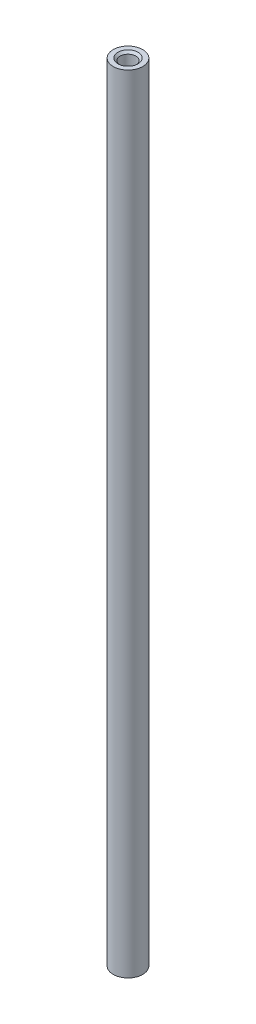
ISO-10303-21;
HEADER;
FILE_DESCRIPTION(('STEP AP214'),'2;1');
FILE_NAME('part.step','',(''),(''),'','','');
FILE_SCHEMA(('AUTOMOTIVE_DESIGN { 1 0 10303 214 1 1 1 1 }'));
ENDSEC;
DATA;
#1=APPLICATION_CONTEXT('core data for automotive mechanical design processes');
#2=APPLICATION_PROTOCOL_DEFINITION('international standard','automotive_design',2000,#1);
#3=PRODUCT_CONTEXT('',#1,'mechanical');
#4=PRODUCT('Part','Part','',(#3));
#5=PRODUCT_RELATED_PRODUCT_CATEGORY('part','',(#4));
#6=PRODUCT_DEFINITION_FORMATION('','',#4);
#7=PRODUCT_DEFINITION_CONTEXT('part definition',#1,'design');
#8=PRODUCT_DEFINITION('design','',#6,#7);
#9=PRODUCT_DEFINITION_SHAPE('','',#8);
#10=(LENGTH_UNIT() NAMED_UNIT(*) SI_UNIT(.MILLI.,.METRE.));
#11=(NAMED_UNIT(*) PLANE_ANGLE_UNIT() SI_UNIT($,.RADIAN.));
#12=(NAMED_UNIT(*) SI_UNIT($,.STERADIAN.) SOLID_ANGLE_UNIT());
#13=UNCERTAINTY_MEASURE_WITH_UNIT(LENGTH_MEASURE(1.E-05),#10,'distance_accuracy_value','');
#14=(GEOMETRIC_REPRESENTATION_CONTEXT(3) GLOBAL_UNCERTAINTY_ASSIGNED_CONTEXT((#13)) GLOBAL_UNIT_ASSIGNED_CONTEXT((#10,
#11,#12)) REPRESENTATION_CONTEXT('',''));
#15=CARTESIAN_POINT('',(0.,0.,0.));
#16=DIRECTION('',(0.,0.,1.));
#17=DIRECTION('',(1.,0.,0.));
#18=AXIS2_PLACEMENT_3D('',#15,#16,#17);
#19=CARTESIAN_POINT('',(0.,80.,0.));
#20=DIRECTION('',(0.,-1.,0.));
#21=DIRECTION('',(0.,0.,-1.));
#22=AXIS2_PLACEMENT_3D('',#19,#20,#21);
#23=CYLINDRICAL_SURFACE('',#22,1.5);
#24=CARTESIAN_POINT('',(0.,80.,0.));
#25=DIRECTION('',(0.,1.,0.));
#26=DIRECTION('',(0.,0.,1.));
#27=AXIS2_PLACEMENT_3D('',#24,#25,#26);
#28=CIRCLE('',#27,1.5);
#29=CARTESIAN_POINT('',(0.,80.,1.5));
#30=VERTEX_POINT('',#29);
#31=EDGE_CURVE('E11',#30,#30,#28,.T.);
#32=ORIENTED_EDGE('',*,*,#31,.F.);
#33=EDGE_LOOP('',(#32));
#34=FACE_BOUND('',#33,.T.);
#35=CARTESIAN_POINT('',(0.,0.,0.));
#36=DIRECTION('',(0.,1.,0.));
#37=DIRECTION('',(0.,0.,1.));
#38=AXIS2_PLACEMENT_3D('',#35,#36,#37);
#39=CIRCLE('',#38,1.5);
#40=CARTESIAN_POINT('',(0.,0.,1.5));
#41=VERTEX_POINT('',#40);
#42=EDGE_CURVE('E38',#41,#41,#39,.T.);
#43=ORIENTED_EDGE('',*,*,#42,.T.);
#44=EDGE_LOOP('',(#43));
#45=FACE_BOUND('',#44,.T.);
#46=ADVANCED_FACE('F35',(#34,#45),#23,.T.);
#47=CARTESIAN_POINT('',(0.,80.,0.));
#48=DIRECTION('',(0.,1.,0.));
#49=DIRECTION('',(0.,0.,1.));
#50=AXIS2_PLACEMENT_3D('',#47,#48,#49);
#51=PLANE('',#50);
#52=CARTESIAN_POINT('',(0.,80.,0.));
#53=DIRECTION('',(0.,1.,0.));
#54=DIRECTION('',(0.,0.,1.));
#55=AXIS2_PLACEMENT_3D('',#52,#53,#54);
#56=CIRCLE('',#55,1.025);
#57=CARTESIAN_POINT('',(0.,80.,1.025));
#58=VERTEX_POINT('',#57);
#59=EDGE_CURVE('E58',#58,#58,#56,.T.);
#60=ORIENTED_EDGE('',*,*,#59,.F.);
#61=EDGE_LOOP('',(#60));
#62=FACE_BOUND('',#61,.T.);
#63=ORIENTED_EDGE('',*,*,#31,.T.);
#64=EDGE_LOOP('',(#63));
#65=FACE_BOUND('',#64,.T.);
#66=ADVANCED_FACE('F82',(#62,#65),#51,.T.);
#67=CARTESIAN_POINT('',(0.,0.,0.));
#68=DIRECTION('',(0.,1.,0.));
#69=DIRECTION('',(0.,0.,1.));
#70=AXIS2_PLACEMENT_3D('',#67,#68,#69);
#71=PLANE('',#70);
#72=CARTESIAN_POINT('',(0.,0.,0.));
#73=DIRECTION('',(0.,-1.,0.));
#74=DIRECTION('',(0.,0.,-1.));
#75=AXIS2_PLACEMENT_3D('',#72,#73,#74);
#76=CIRCLE('',#75,1.025);
#77=CARTESIAN_POINT('',(0.,0.,-1.025));
#78=VERTEX_POINT('',#77);
#79=EDGE_CURVE('E65',#78,#78,#76,.T.);
#80=ORIENTED_EDGE('',*,*,#79,.F.);
#81=EDGE_LOOP('',(#80));
#82=FACE_BOUND('',#81,.T.);
#83=ORIENTED_EDGE('',*,*,#42,.F.);
#84=EDGE_LOOP('',(#83));
#85=FACE_BOUND('',#84,.T.);
#86=ADVANCED_FACE('F79',(#82,#85),#71,.F.);
#87=CARTESIAN_POINT('',(0.,72.,0.));
#88=DIRECTION('',(0.,1.,0.));
#89=DIRECTION('',(0.,0.,1.));
#90=AXIS2_PLACEMENT_3D('',#87,#88,#89);
#91=CONICAL_SURFACE('',#90,0.799999999999998,1.02974425867665);
#92=CARTESIAN_POINT('',(0.,71.519311504778,0.));
#93=VERTEX_POINT('',#92);
#94=VERTEX_LOOP('',#93);
#95=FACE_BOUND('',#94,.T.);
#96=CARTESIAN_POINT('',(0.,72.,0.));
#97=DIRECTION('',(0.,1.,0.));
#98=DIRECTION('',(0.,0.,1.));
#99=AXIS2_PLACEMENT_3D('',#96,#97,#98);
#100=CIRCLE('',#99,0.799999999999998);
#101=CARTESIAN_POINT('',(0.,72.,0.799999999999998));
#102=VERTEX_POINT('',#101);
#103=EDGE_CURVE('E71',#102,#102,#100,.T.);
#104=ORIENTED_EDGE('',*,*,#103,.T.);
#105=EDGE_LOOP('',(#104));
#106=FACE_BOUND('',#105,.T.);
#107=ADVANCED_FACE('F81',(#95,#106),#91,.F.);
#108=CARTESIAN_POINT('',(0.,80.,0.));
#109=DIRECTION('',(0.,1.,0.));
#110=DIRECTION('',(0.,0.,1.));
#111=AXIS2_PLACEMENT_3D('',#108,#109,#110);
#112=CYLINDRICAL_SURFACE('',#111,0.799999999999999);
#113=ORIENTED_EDGE('',*,*,#103,.F.);
#114=EDGE_LOOP('',(#113));
#115=FACE_BOUND('',#114,.T.);
#116=CARTESIAN_POINT('',(0.,79.775,0.));
#117=DIRECTION('',(0.,1.,0.));
#118=DIRECTION('',(0.,0.,1.));
#119=AXIS2_PLACEMENT_3D('',#116,#117,#118);
#120=CIRCLE('',#119,0.799999999999999);
#121=CARTESIAN_POINT('',(0.,79.775,0.799999999999999));
#122=VERTEX_POINT('',#121);
#123=EDGE_CURVE('E62',#122,#122,#120,.T.);
#124=ORIENTED_EDGE('',*,*,#123,.T.);
#125=EDGE_LOOP('',(#124));
#126=FACE_BOUND('',#125,.T.);
#127=ADVANCED_FACE('F88',(#115,#126),#112,.F.);
#128=CARTESIAN_POINT('',(0.,80.,0.));
#129=DIRECTION('',(0.,1.,0.));
#130=DIRECTION('',(0.,0.,1.));
#131=AXIS2_PLACEMENT_3D('',#128,#129,#130);
#132=CONICAL_SURFACE('',#131,1.025,0.785398163397443);
#133=ORIENTED_EDGE('',*,*,#123,.F.);
#134=EDGE_LOOP('',(#133));
#135=FACE_BOUND('',#134,.T.);
#136=ORIENTED_EDGE('',*,*,#59,.T.);
#137=EDGE_LOOP('',(#136));
#138=FACE_BOUND('',#137,.T.);
#139=ADVANCED_FACE('F52',(#135,#138),#132,.F.);
#140=CARTESIAN_POINT('',(0.,7.99999999999999,0.));
#141=DIRECTION('',(0.,-1.,0.));
#142=DIRECTION('',(0.,0.,-1.));
#143=AXIS2_PLACEMENT_3D('',#140,#141,#142);
#144=CONICAL_SURFACE('',#143,0.799999999999988,1.02974425867664);
#145=CARTESIAN_POINT('',(0.,8.48068849522205,0.));
#146=VERTEX_POINT('',#145);
#147=VERTEX_LOOP('',#146);
#148=FACE_BOUND('',#147,.T.);
#149=CARTESIAN_POINT('',(0.,7.99999999999999,0.));
#150=DIRECTION('',(0.,-1.,0.));
#151=DIRECTION('',(0.,0.,-1.));
#152=AXIS2_PLACEMENT_3D('',#149,#150,#151);
#153=CIRCLE('',#152,0.799999999999988);
#154=CARTESIAN_POINT('',(0.,7.99999999999999,-0.799999999999988));
#155=VERTEX_POINT('',#154);
#156=EDGE_CURVE('E56',#155,#155,#153,.T.);
#157=ORIENTED_EDGE('',*,*,#156,.T.);
#158=EDGE_LOOP('',(#157));
#159=FACE_BOUND('',#158,.T.);
#160=ADVANCED_FACE('F48',(#148,#159),#144,.F.);
#161=CARTESIAN_POINT('',(0.,0.,0.));
#162=DIRECTION('',(0.,-1.,0.));
#163=DIRECTION('',(0.,0.,-1.));
#164=AXIS2_PLACEMENT_3D('',#161,#162,#163);
#165=CYLINDRICAL_SURFACE('',#164,0.799999999999989);
#166=ORIENTED_EDGE('',*,*,#156,.F.);
#167=EDGE_LOOP('',(#166));
#168=FACE_BOUND('',#167,.T.);
#169=CARTESIAN_POINT('',(0.,0.225000000000003,0.));
#170=DIRECTION('',(0.,-1.,0.));
#171=DIRECTION('',(0.,0.,-1.));
#172=AXIS2_PLACEMENT_3D('',#169,#170,#171);
#173=CIRCLE('',#172,0.79999999999999);
#174=CARTESIAN_POINT('',(0.,0.225000000000003,-0.79999999999999));
#175=VERTEX_POINT('',#174);
#176=EDGE_CURVE('E59',#175,#175,#173,.T.);
#177=ORIENTED_EDGE('',*,*,#176,.T.);
#178=EDGE_LOOP('',(#177));
#179=FACE_BOUND('',#178,.T.);
#180=ADVANCED_FACE('F51',(#168,#179),#165,.F.);
#181=CARTESIAN_POINT('',(0.,0.,0.));
#182=DIRECTION('',(0.,-1.,0.));
#183=DIRECTION('',(0.,0.,-1.));
#184=AXIS2_PLACEMENT_3D('',#181,#182,#183);
#185=CONICAL_SURFACE('',#184,1.025,0.78539816339746);
#186=ORIENTED_EDGE('',*,*,#176,.F.);
#187=EDGE_LOOP('',(#186));
#188=FACE_BOUND('',#187,.T.);
#189=ORIENTED_EDGE('',*,*,#79,.T.);
#190=EDGE_LOOP('',(#189));
#191=FACE_BOUND('',#190,.T.);
#192=ADVANCED_FACE('F148',(#188,#191),#185,.F.);
#193=CLOSED_SHELL('',(#46,#66,#86,#107,#127,#139,#160,#180,#192));
#194=MANIFOLD_SOLID_BREP('B2',#193);
#195=ADVANCED_BREP_SHAPE_REPRESENTATION('',(#18,#194),#14);
#196=SHAPE_DEFINITION_REPRESENTATION(#9,#195);
ENDSEC;
END-ISO-10303-21;
